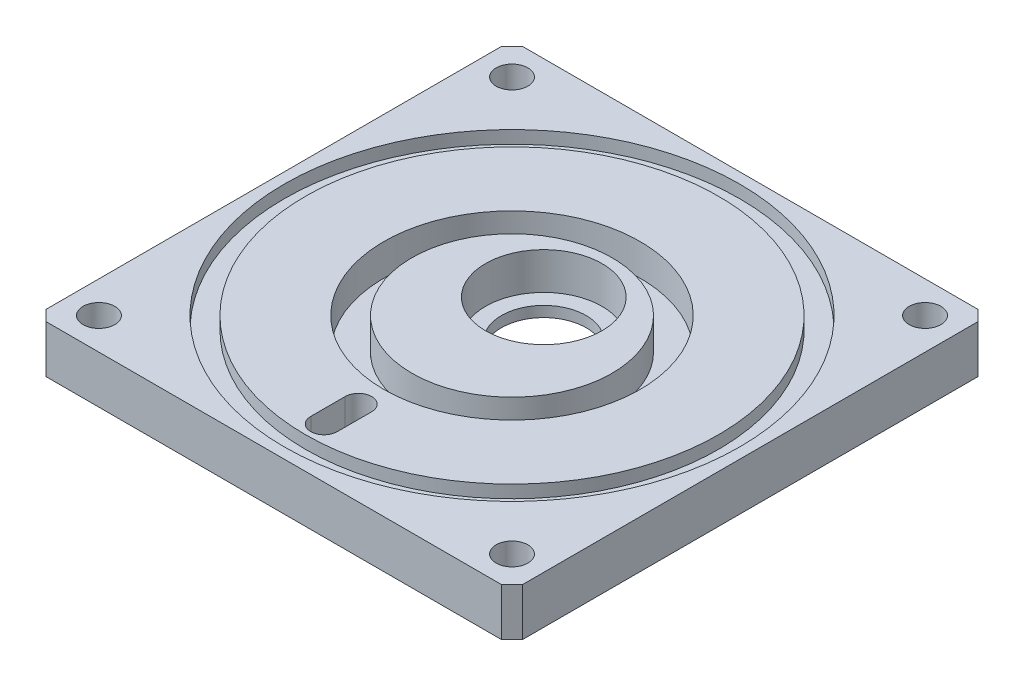
ISO-10303-21;
HEADER;
FILE_DESCRIPTION(('STEP AP214'),'2;1');
FILE_NAME('part.step','',(''),(''),'','','');
FILE_SCHEMA(('AUTOMOTIVE_DESIGN { 1 0 10303 214 1 1 1 1 }'));
ENDSEC;
DATA;
#1=APPLICATION_CONTEXT('core data for automotive mechanical design processes');
#2=APPLICATION_PROTOCOL_DEFINITION('international standard','automotive_design',2000,#1);
#3=PRODUCT_CONTEXT('',#1,'mechanical');
#4=PRODUCT('Part','Part','',(#3));
#5=PRODUCT_RELATED_PRODUCT_CATEGORY('part','',(#4));
#6=PRODUCT_DEFINITION_FORMATION('','',#4);
#7=PRODUCT_DEFINITION_CONTEXT('part definition',#1,'design');
#8=PRODUCT_DEFINITION('design','',#6,#7);
#9=PRODUCT_DEFINITION_SHAPE('','',#8);
#10=(LENGTH_UNIT() NAMED_UNIT(*) SI_UNIT(.MILLI.,.METRE.));
#11=(NAMED_UNIT(*) PLANE_ANGLE_UNIT() SI_UNIT($,.RADIAN.));
#12=(NAMED_UNIT(*) SI_UNIT($,.STERADIAN.) SOLID_ANGLE_UNIT());
#13=UNCERTAINTY_MEASURE_WITH_UNIT(LENGTH_MEASURE(1.E-05),#10,'distance_accuracy_value','');
#14=(GEOMETRIC_REPRESENTATION_CONTEXT(3) GLOBAL_UNCERTAINTY_ASSIGNED_CONTEXT((#13)) GLOBAL_UNIT_ASSIGNED_CONTEXT((#10,
#11,#12)) REPRESENTATION_CONTEXT('',''));
#15=CARTESIAN_POINT('',(0.,0.,0.));
#16=DIRECTION('',(0.,0.,1.));
#17=DIRECTION('',(1.,0.,0.));
#18=AXIS2_PLACEMENT_3D('',#15,#16,#17);
#19=CARTESIAN_POINT('',(0.,4.5,0.));
#20=DIRECTION('',(0.,-1.,0.));
#21=DIRECTION('',(0.,0.,-1.));
#22=AXIS2_PLACEMENT_3D('',#19,#20,#21);
#23=PLANE('',#22);
#24=DIRECTION('',(0.,0.,1.));
#25=VECTOR('',#24,1.);
#26=CARTESIAN_POINT('',(-1.25,4.5,14.5));
#27=LINE('',#26,#25);
#28=CARTESIAN_POINT('',(-1.25,4.5,14.5));
#29=VERTEX_POINT('',#28);
#30=CARTESIAN_POINT('',(-1.25,4.5,17.75));
#31=VERTEX_POINT('',#30);
#32=EDGE_CURVE('E174',#29,#31,#27,.T.);
#33=ORIENTED_EDGE('',*,*,#32,.F.);
#34=CARTESIAN_POINT('',(0.,4.5,14.5));
#35=DIRECTION('',(0.,1.,0.));
#36=DIRECTION('',(0.,0.,1.));
#37=AXIS2_PLACEMENT_3D('',#34,#35,#36);
#38=CIRCLE('',#37,1.25);
#39=CARTESIAN_POINT('',(1.25,4.5,14.5));
#40=VERTEX_POINT('',#39);
#41=EDGE_CURVE('E137',#40,#29,#38,.T.);
#42=ORIENTED_EDGE('',*,*,#41,.F.);
#43=DIRECTION('',(0.,0.,-1.));
#44=VECTOR('',#43,1.);
#45=CARTESIAN_POINT('',(1.25,4.5,14.5));
#46=LINE('',#45,#44);
#47=CARTESIAN_POINT('',(1.25,4.5,17.75));
#48=VERTEX_POINT('',#47);
#49=EDGE_CURVE('E158',#48,#40,#46,.T.);
#50=ORIENTED_EDGE('',*,*,#49,.F.);
#51=CARTESIAN_POINT('',(0.,4.5,17.75));
#52=DIRECTION('',(0.,1.,0.));
#53=DIRECTION('',(0.,0.,1.));
#54=AXIS2_PLACEMENT_3D('',#51,#52,#53);
#55=CIRCLE('',#54,1.25);
#56=EDGE_CURVE('E162',#31,#48,#55,.T.);
#57=ORIENTED_EDGE('',*,*,#56,.F.);
#58=EDGE_LOOP('',(#33,#42,#50,#57));
#59=FACE_BOUND('',#58,.T.);
#60=CARTESIAN_POINT('',(0.,4.5,0.));
#61=DIRECTION('',(0.,1.,0.));
#62=DIRECTION('',(0.,0.,1.));
#63=AXIS2_PLACEMENT_3D('',#60,#61,#62);
#64=CIRCLE('',#63,12.1);
#65=CARTESIAN_POINT('',(0.,4.5,12.1));
#66=VERTEX_POINT('',#65);
#67=EDGE_CURVE('E210',#66,#66,#64,.T.);
#68=ORIENTED_EDGE('',*,*,#67,.F.);
#69=EDGE_LOOP('',(#68));
#70=FACE_BOUND('',#69,.T.);
#71=CARTESIAN_POINT('',(0.,4.5,0.));
#72=DIRECTION('',(0.,1.,0.));
#73=DIRECTION('',(0.,0.,1.));
#74=AXIS2_PLACEMENT_3D('',#71,#72,#73);
#75=CIRCLE('',#74,19.5);
#76=CARTESIAN_POINT('',(0.,4.5,19.5));
#77=VERTEX_POINT('',#76);
#78=EDGE_CURVE('E184',#77,#77,#75,.T.);
#79=ORIENTED_EDGE('',*,*,#78,.T.);
#80=EDGE_LOOP('',(#79));
#81=FACE_BOUND('',#80,.T.);
#82=ADVANCED_FACE('F39',(#59,#70,#81),#23,.F.);
#83=CARTESIAN_POINT('',(0.,4.5,-3.));
#84=DIRECTION('',(0.,1.,0.));
#85=DIRECTION('',(0.,0.,1.));
#86=AXIS2_PLACEMENT_3D('',#83,#84,#85);
#87=CIRCLE('',#86,5.5);
#88=CARTESIAN_POINT('',(0.,4.5,2.5));
#89=VERTEX_POINT('',#88);
#90=EDGE_CURVE('E226',#89,#89,#87,.T.);
#91=ORIENTED_EDGE('',*,*,#90,.F.);
#92=EDGE_LOOP('',(#91));
#93=FACE_BOUND('',#92,.T.);
#94=CARTESIAN_POINT('',(0.,4.5,0.));
#95=DIRECTION('',(0.,1.,0.));
#96=DIRECTION('',(0.,0.,1.));
#97=AXIS2_PLACEMENT_3D('',#94,#95,#96);
#98=CIRCLE('',#97,9.45);
#99=CARTESIAN_POINT('',(0.,4.5,9.45));
#100=VERTEX_POINT('',#99);
#101=EDGE_CURVE('E202',#100,#100,#98,.T.);
#102=ORIENTED_EDGE('',*,*,#101,.T.);
#103=EDGE_LOOP('',(#102));
#104=FACE_BOUND('',#103,.T.);
#105=ADVANCED_FACE('F348',(#93,#104),#23,.F.);
#106=CARTESIAN_POINT('',(22.5,4.5,22.5));
#107=DIRECTION('',(-1.,0.,0.));
#108=DIRECTION('',(0.,0.,1.));
#109=AXIS2_PLACEMENT_3D('',#106,#107,#108);
#110=PLANE('',#109);
#111=DIRECTION('',(0.,0.,-1.));
#112=VECTOR('',#111,1.);
#113=CARTESIAN_POINT('',(22.5,0.,22.5));
#114=LINE('',#113,#112);
#115=CARTESIAN_POINT('',(22.5,0.,21.5));
#116=VERTEX_POINT('',#115);
#117=CARTESIAN_POINT('',(22.5,0.,-21.5));
#118=VERTEX_POINT('',#117);
#119=EDGE_CURVE('E234',#116,#118,#114,.T.);
#120=ORIENTED_EDGE('',*,*,#119,.T.);
#121=DIRECTION('',(0.,1.,0.));
#122=VECTOR('',#121,1.);
#123=CARTESIAN_POINT('',(22.5,4.5,-21.5));
#124=LINE('',#123,#122);
#125=CARTESIAN_POINT('',(22.5,4.5,-21.5));
#126=VERTEX_POINT('',#125);
#127=EDGE_CURVE('E289',#118,#126,#124,.T.);
#128=ORIENTED_EDGE('',*,*,#127,.T.);
#129=DIRECTION('',(0.,0.,-1.));
#130=VECTOR('',#129,1.);
#131=CARTESIAN_POINT('',(22.5,4.5,22.5));
#132=LINE('',#131,#130);
#133=CARTESIAN_POINT('',(22.5,4.5,21.5));
#134=VERTEX_POINT('',#133);
#135=EDGE_CURVE('E238',#134,#126,#132,.T.);
#136=ORIENTED_EDGE('',*,*,#135,.F.);
#137=DIRECTION('',(0.,-1.,0.));
#138=VECTOR('',#137,1.);
#139=CARTESIAN_POINT('',(22.5,4.5,21.5));
#140=LINE('',#139,#138);
#141=EDGE_CURVE('E285',#134,#116,#140,.T.);
#142=ORIENTED_EDGE('',*,*,#141,.T.);
#143=EDGE_LOOP('',(#120,#128,#136,#142));
#144=FACE_BOUND('',#143,.T.);
#145=ADVANCED_FACE('F333',(#144),#110,.F.);
#146=CARTESIAN_POINT('',(-22.5,4.5,-22.5));
#147=DIRECTION('',(0.,0.,1.));
#148=DIRECTION('',(1.,0.,0.));
#149=AXIS2_PLACEMENT_3D('',#146,#147,#148);
#150=PLANE('',#149);
#151=DIRECTION('',(-1.,0.,0.));
#152=VECTOR('',#151,1.);
#153=CARTESIAN_POINT('',(-22.5,4.5,-22.5));
#154=LINE('',#153,#152);
#155=CARTESIAN_POINT('',(21.5,4.5,-22.5));
#156=VERTEX_POINT('',#155);
#157=CARTESIAN_POINT('',(-21.5,4.5,-22.5));
#158=VERTEX_POINT('',#157);
#159=EDGE_CURVE('E242',#156,#158,#154,.T.);
#160=ORIENTED_EDGE('',*,*,#159,.F.);
#161=DIRECTION('',(0.,-1.,0.));
#162=VECTOR('',#161,1.);
#163=CARTESIAN_POINT('',(21.5,4.5,-22.5));
#164=LINE('',#163,#162);
#165=CARTESIAN_POINT('',(21.5,0.,-22.5));
#166=VERTEX_POINT('',#165);
#167=EDGE_CURVE('E269',#156,#166,#164,.T.);
#168=ORIENTED_EDGE('',*,*,#167,.T.);
#169=DIRECTION('',(-1.,0.,0.));
#170=VECTOR('',#169,1.);
#171=CARTESIAN_POINT('',(-22.5,0.,-22.5));
#172=LINE('',#171,#170);
#173=CARTESIAN_POINT('',(-21.5,0.,-22.5));
#174=VERTEX_POINT('',#173);
#175=EDGE_CURVE('E257',#166,#174,#172,.T.);
#176=ORIENTED_EDGE('',*,*,#175,.T.);
#177=DIRECTION('',(0.,1.,0.));
#178=VECTOR('',#177,1.);
#179=CARTESIAN_POINT('',(-21.5,4.5,-22.5));
#180=LINE('',#179,#178);
#181=EDGE_CURVE('E253',#174,#158,#180,.T.);
#182=ORIENTED_EDGE('',*,*,#181,.T.);
#183=EDGE_LOOP('',(#160,#168,#176,#182));
#184=FACE_BOUND('',#183,.T.);
#185=ADVANCED_FACE('F341',(#184),#150,.F.);
#186=CARTESIAN_POINT('',(-22.5,4.5,22.5));
#187=DIRECTION('',(1.,0.,0.));
#188=DIRECTION('',(0.,0.,-1.));
#189=AXIS2_PLACEMENT_3D('',#186,#187,#188);
#190=PLANE('',#189);
#191=DIRECTION('',(0.,0.,1.));
#192=VECTOR('',#191,1.);
#193=CARTESIAN_POINT('',(-22.5,0.,22.5));
#194=LINE('',#193,#192);
#195=CARTESIAN_POINT('',(-22.5,0.,-21.5));
#196=VERTEX_POINT('',#195);
#197=CARTESIAN_POINT('',(-22.5,0.,21.5));
#198=VERTEX_POINT('',#197);
#199=EDGE_CURVE('E261',#196,#198,#194,.T.);
#200=ORIENTED_EDGE('',*,*,#199,.T.);
#201=DIRECTION('',(0.,1.,0.));
#202=VECTOR('',#201,1.);
#203=CARTESIAN_POINT('',(-22.5,4.5,21.5));
#204=LINE('',#203,#202);
#205=CARTESIAN_POINT('',(-22.5,4.5,21.5));
#206=VERTEX_POINT('',#205);
#207=EDGE_CURVE('E11',#198,#206,#204,.T.);
#208=ORIENTED_EDGE('',*,*,#207,.T.);
#209=DIRECTION('',(0.,0.,1.));
#210=VECTOR('',#209,1.);
#211=CARTESIAN_POINT('',(-22.5,4.5,22.5));
#212=LINE('',#211,#210);
#213=CARTESIAN_POINT('',(-22.5,4.5,-21.5));
#214=VERTEX_POINT('',#213);
#215=EDGE_CURVE('E247',#214,#206,#212,.T.);
#216=ORIENTED_EDGE('',*,*,#215,.F.);
#217=DIRECTION('',(0.,-1.,0.));
#218=VECTOR('',#217,1.);
#219=CARTESIAN_POINT('',(-22.5,4.5,-21.5));
#220=LINE('',#219,#218);
#221=EDGE_CURVE('E48',#214,#196,#220,.T.);
#222=ORIENTED_EDGE('',*,*,#221,.T.);
#223=EDGE_LOOP('',(#200,#208,#216,#222));
#224=FACE_BOUND('',#223,.T.);
#225=ADVANCED_FACE('F314',(#224),#190,.F.);
#226=CARTESIAN_POINT('',(-22.5,4.5,22.5));
#227=DIRECTION('',(0.,0.,-1.));
#228=DIRECTION('',(-1.,0.,0.));
#229=AXIS2_PLACEMENT_3D('',#226,#227,#228);
#230=PLANE('',#229);
#231=DIRECTION('',(1.,0.,0.));
#232=VECTOR('',#231,1.);
#233=CARTESIAN_POINT('',(-22.5,0.,22.5));
#234=LINE('',#233,#232);
#235=CARTESIAN_POINT('',(-21.5,0.,22.5));
#236=VERTEX_POINT('',#235);
#237=CARTESIAN_POINT('',(21.5,0.,22.5));
#238=VERTEX_POINT('',#237);
#239=EDGE_CURVE('E243',#236,#238,#234,.T.);
#240=ORIENTED_EDGE('',*,*,#239,.T.);
#241=DIRECTION('',(0.,1.,0.));
#242=VECTOR('',#241,1.);
#243=CARTESIAN_POINT('',(21.5,4.5,22.5));
#244=LINE('',#243,#242);
#245=CARTESIAN_POINT('',(21.5,4.5,22.5));
#246=VERTEX_POINT('',#245);
#247=EDGE_CURVE('E55',#238,#246,#244,.T.);
#248=ORIENTED_EDGE('',*,*,#247,.T.);
#249=DIRECTION('',(1.,0.,0.));
#250=VECTOR('',#249,1.);
#251=CARTESIAN_POINT('',(-22.5,4.5,22.5));
#252=LINE('',#251,#250);
#253=CARTESIAN_POINT('',(-21.5,4.5,22.5));
#254=VERTEX_POINT('',#253);
#255=EDGE_CURVE('E250',#254,#246,#252,.T.);
#256=ORIENTED_EDGE('',*,*,#255,.F.);
#257=DIRECTION('',(0.,-1.,0.));
#258=VECTOR('',#257,1.);
#259=CARTESIAN_POINT('',(-21.5,4.5,22.5));
#260=LINE('',#259,#258);
#261=EDGE_CURVE('E303',#254,#236,#260,.T.);
#262=ORIENTED_EDGE('',*,*,#261,.T.);
#263=EDGE_LOOP('',(#240,#248,#256,#262));
#264=FACE_BOUND('',#263,.T.);
#265=ADVANCED_FACE('F324',(#264),#230,.F.);
#266=CARTESIAN_POINT('',(-19.5,4.5,-19.5));
#267=DIRECTION('',(0.,-1.,0.));
#268=DIRECTION('',(0.,0.,1.));
#269=AXIS2_PLACEMENT_3D('',#266,#267,#268);
#270=CIRCLE('',#269,1.5);
#271=CARTESIAN_POINT('',(-19.5,4.5,-18.));
#272=VERTEX_POINT('',#271);
#273=EDGE_CURVE('E370',#272,#272,#270,.T.);
#274=ORIENTED_EDGE('',*,*,#273,.T.);
#275=EDGE_LOOP('',(#274));
#276=FACE_BOUND('',#275,.T.);
#277=CARTESIAN_POINT('',(19.5,4.5,-19.5));
#278=DIRECTION('',(0.,-1.,0.));
#279=DIRECTION('',(0.,0.,-1.));
#280=AXIS2_PLACEMENT_3D('',#277,#278,#279);
#281=CIRCLE('',#280,1.5);
#282=CARTESIAN_POINT('',(19.5,4.5,-21.));
#283=VERTEX_POINT('',#282);
#284=EDGE_CURVE('E374',#283,#283,#281,.T.);
#285=ORIENTED_EDGE('',*,*,#284,.T.);
#286=EDGE_LOOP('',(#285));
#287=FACE_BOUND('',#286,.T.);
#288=CARTESIAN_POINT('',(19.5,4.5,19.5));
#289=DIRECTION('',(0.,-1.,0.));
#290=DIRECTION('',(0.,0.,1.));
#291=AXIS2_PLACEMENT_3D('',#288,#289,#290);
#292=CIRCLE('',#291,1.5);
#293=CARTESIAN_POINT('',(19.5,4.5,21.));
#294=VERTEX_POINT('',#293);
#295=EDGE_CURVE('E378',#294,#294,#292,.T.);
#296=ORIENTED_EDGE('',*,*,#295,.T.);
#297=EDGE_LOOP('',(#296));
#298=FACE_BOUND('',#297,.T.);
#299=CARTESIAN_POINT('',(-19.5,4.5,19.5));
#300=DIRECTION('',(0.,-1.,0.));
#301=DIRECTION('',(0.,0.,-1.));
#302=AXIS2_PLACEMENT_3D('',#299,#300,#301);
#303=CIRCLE('',#302,1.5);
#304=CARTESIAN_POINT('',(-19.5,4.5,18.));
#305=VERTEX_POINT('',#304);
#306=EDGE_CURVE('E175',#305,#305,#303,.T.);
#307=ORIENTED_EDGE('',*,*,#306,.T.);
#308=EDGE_LOOP('',(#307));
#309=FACE_BOUND('',#308,.T.);
#310=CARTESIAN_POINT('',(0.,4.5,0.));
#311=DIRECTION('',(0.,1.,0.));
#312=DIRECTION('',(0.,0.,1.));
#313=AXIS2_PLACEMENT_3D('',#310,#311,#312);
#314=CIRCLE('',#313,21.5);
#315=CARTESIAN_POINT('',(0.,4.5,21.5));
#316=VERTEX_POINT('',#315);
#317=EDGE_CURVE('E194',#316,#316,#314,.T.);
#318=ORIENTED_EDGE('',*,*,#317,.F.);
#319=EDGE_LOOP('',(#318));
#320=FACE_BOUND('',#319,.T.);
#321=ORIENTED_EDGE('',*,*,#135,.T.);
#322=DIRECTION('',(0.707106781186545,0.,0.70710678118655));
#323=VECTOR('',#322,1.);
#324=CARTESIAN_POINT('',(21.5,4.5,-22.5));
#325=LINE('',#324,#323);
#326=EDGE_CURVE('E300',#126,#156,#325,.F.);
#327=ORIENTED_EDGE('',*,*,#326,.T.);
#328=ORIENTED_EDGE('',*,*,#159,.T.);
#329=DIRECTION('',(0.70710678118655,0.,-0.707106781186545));
#330=VECTOR('',#329,1.);
#331=CARTESIAN_POINT('',(-22.5,4.5,-21.5));
#332=LINE('',#331,#330);
#333=EDGE_CURVE('E292',#158,#214,#332,.F.);
#334=ORIENTED_EDGE('',*,*,#333,.T.);
#335=ORIENTED_EDGE('',*,*,#215,.T.);
#336=DIRECTION('',(-0.707106781186545,0.,-0.70710678118655));
#337=VECTOR('',#336,1.);
#338=CARTESIAN_POINT('',(-21.5,4.5,22.5));
#339=LINE('',#338,#337);
#340=EDGE_CURVE('E62',#206,#254,#339,.F.);
#341=ORIENTED_EDGE('',*,*,#340,.T.);
#342=ORIENTED_EDGE('',*,*,#255,.T.);
#343=DIRECTION('',(-0.70710678118655,0.,0.707106781186545));
#344=VECTOR('',#343,1.);
#345=CARTESIAN_POINT('',(22.5,4.5,21.5));
#346=LINE('',#345,#344);
#347=EDGE_CURVE('E297',#246,#134,#346,.F.);
#348=ORIENTED_EDGE('',*,*,#347,.T.);
#349=EDGE_LOOP('',(#321,#327,#328,#334,#335,#341,#342,#348));
#350=FACE_BOUND('',#349,.T.);
#351=ADVANCED_FACE('F326',(#276,#287,#298,#309,#320,#350),#23,.F.);
#352=CARTESIAN_POINT('',(0.,0.,0.));
#353=DIRECTION('',(0.,-1.,0.));
#354=DIRECTION('',(0.,0.,-1.));
#355=AXIS2_PLACEMENT_3D('',#352,#353,#354);
#356=PLANE('',#355);
#357=CARTESIAN_POINT('',(-19.5,0.,-19.5));
#358=DIRECTION('',(0.,-1.,0.));
#359=DIRECTION('',(0.,0.,1.));
#360=AXIS2_PLACEMENT_3D('',#357,#358,#359);
#361=CIRCLE('',#360,1.5);
#362=CARTESIAN_POINT('',(-19.5,0.,-18.));
#363=VERTEX_POINT('',#362);
#364=EDGE_CURVE('E635',#363,#363,#361,.T.);
#365=ORIENTED_EDGE('',*,*,#364,.F.);
#366=EDGE_LOOP('',(#365));
#367=FACE_BOUND('',#366,.T.);
#368=CARTESIAN_POINT('',(19.5,0.,-19.5));
#369=DIRECTION('',(0.,-1.,0.));
#370=DIRECTION('',(0.,0.,-1.));
#371=AXIS2_PLACEMENT_3D('',#368,#369,#370);
#372=CIRCLE('',#371,1.5);
#373=CARTESIAN_POINT('',(19.5,0.,-21.));
#374=VERTEX_POINT('',#373);
#375=EDGE_CURVE('E639',#374,#374,#372,.T.);
#376=ORIENTED_EDGE('',*,*,#375,.F.);
#377=EDGE_LOOP('',(#376));
#378=FACE_BOUND('',#377,.T.);
#379=CARTESIAN_POINT('',(19.5,0.,19.5));
#380=DIRECTION('',(0.,-1.,0.));
#381=DIRECTION('',(0.,0.,1.));
#382=AXIS2_PLACEMENT_3D('',#379,#380,#381);
#383=CIRCLE('',#382,1.5);
#384=CARTESIAN_POINT('',(19.5,0.,21.));
#385=VERTEX_POINT('',#384);
#386=EDGE_CURVE('E648',#385,#385,#383,.T.);
#387=ORIENTED_EDGE('',*,*,#386,.F.);
#388=EDGE_LOOP('',(#387));
#389=FACE_BOUND('',#388,.T.);
#390=CARTESIAN_POINT('',(-19.5,0.,19.5));
#391=DIRECTION('',(0.,-1.,0.));
#392=DIRECTION('',(0.,0.,-1.));
#393=AXIS2_PLACEMENT_3D('',#390,#391,#392);
#394=CIRCLE('',#393,1.5);
#395=CARTESIAN_POINT('',(-19.5,0.,18.));
#396=VERTEX_POINT('',#395);
#397=EDGE_CURVE('E165',#396,#396,#394,.T.);
#398=ORIENTED_EDGE('',*,*,#397,.F.);
#399=EDGE_LOOP('',(#398));
#400=FACE_BOUND('',#399,.T.);
#401=CARTESIAN_POINT('',(0.,0.,14.5));
#402=DIRECTION('',(0.,1.,0.));
#403=DIRECTION('',(0.,0.,1.));
#404=AXIS2_PLACEMENT_3D('',#401,#402,#403);
#405=CIRCLE('',#404,1.25);
#406=CARTESIAN_POINT('',(1.25,0.,14.5));
#407=VERTEX_POINT('',#406);
#408=CARTESIAN_POINT('',(-1.25,0.,14.5));
#409=VERTEX_POINT('',#408);
#410=EDGE_CURVE('E134',#407,#409,#405,.T.);
#411=ORIENTED_EDGE('',*,*,#410,.T.);
#412=DIRECTION('',(0.,0.,1.));
#413=VECTOR('',#412,1.);
#414=CARTESIAN_POINT('',(-1.25,0.,14.5));
#415=LINE('',#414,#413);
#416=CARTESIAN_POINT('',(-1.25,0.,17.75));
#417=VERTEX_POINT('',#416);
#418=EDGE_CURVE('E147',#409,#417,#415,.T.);
#419=ORIENTED_EDGE('',*,*,#418,.T.);
#420=CARTESIAN_POINT('',(0.,0.,17.75));
#421=DIRECTION('',(0.,1.,0.));
#422=DIRECTION('',(0.,0.,1.));
#423=AXIS2_PLACEMENT_3D('',#420,#421,#422);
#424=CIRCLE('',#423,1.25);
#425=CARTESIAN_POINT('',(1.25,0.,17.75));
#426=VERTEX_POINT('',#425);
#427=EDGE_CURVE('E152',#417,#426,#424,.T.);
#428=ORIENTED_EDGE('',*,*,#427,.T.);
#429=DIRECTION('',(0.,0.,-1.));
#430=VECTOR('',#429,1.);
#431=CARTESIAN_POINT('',(1.25,0.,14.5));
#432=LINE('',#431,#430);
#433=EDGE_CURVE('E143',#426,#407,#432,.T.);
#434=ORIENTED_EDGE('',*,*,#433,.T.);
#435=EDGE_LOOP('',(#411,#419,#428,#434));
#436=FACE_BOUND('',#435,.T.);
#437=CARTESIAN_POINT('',(0.,0.,-3.));
#438=DIRECTION('',(0.,1.,0.));
#439=DIRECTION('',(0.,0.,1.));
#440=AXIS2_PLACEMENT_3D('',#437,#438,#439);
#441=CIRCLE('',#440,4.);
#442=CARTESIAN_POINT('',(0.,0.,1.));
#443=VERTEX_POINT('',#442);
#444=EDGE_CURVE('E222',#443,#443,#441,.T.);
#445=ORIENTED_EDGE('',*,*,#444,.T.);
#446=EDGE_LOOP('',(#445));
#447=FACE_BOUND('',#446,.T.);
#448=ORIENTED_EDGE('',*,*,#175,.F.);
#449=DIRECTION('',(-0.707106781186545,0.,-0.70710678118655));
#450=VECTOR('',#449,1.);
#451=CARTESIAN_POINT('',(22.0000000000001,0.,-21.9999999999999));
#452=LINE('',#451,#450);
#453=EDGE_CURVE('E282',#166,#118,#452,.F.);
#454=ORIENTED_EDGE('',*,*,#453,.T.);
#455=ORIENTED_EDGE('',*,*,#119,.F.);
#456=DIRECTION('',(0.70710678118655,0.,-0.707106781186545));
#457=VECTOR('',#456,1.);
#458=CARTESIAN_POINT('',(21.9999999999999,0.,22.0000000000001));
#459=LINE('',#458,#457);
#460=EDGE_CURVE('E279',#116,#238,#459,.F.);
#461=ORIENTED_EDGE('',*,*,#460,.T.);
#462=ORIENTED_EDGE('',*,*,#239,.F.);
#463=DIRECTION('',(0.707106781186545,0.,0.70710678118655));
#464=VECTOR('',#463,1.);
#465=CARTESIAN_POINT('',(-22.0000000000001,0.,21.9999999999999));
#466=LINE('',#465,#464);
#467=EDGE_CURVE('E276',#236,#198,#466,.F.);
#468=ORIENTED_EDGE('',*,*,#467,.T.);
#469=ORIENTED_EDGE('',*,*,#199,.F.);
#470=DIRECTION('',(-0.70710678118655,0.,0.707106781186545));
#471=VECTOR('',#470,1.);
#472=CARTESIAN_POINT('',(-21.9999999999999,0.,-22.0000000000001));
#473=LINE('',#472,#471);
#474=EDGE_CURVE('E273',#196,#174,#473,.F.);
#475=ORIENTED_EDGE('',*,*,#474,.T.);
#476=EDGE_LOOP('',(#448,#454,#455,#461,#462,#468,#469,#475));
#477=FACE_BOUND('',#476,.T.);
#478=ADVANCED_FACE('F154',(#367,#378,#389,#400,#436,#447,#477),#356,.T.);
#479=CARTESIAN_POINT('',(0.,1.,-3.));
#480=DIRECTION('',(0.,1.,0.));
#481=DIRECTION('',(0.,0.,1.));
#482=AXIS2_PLACEMENT_3D('',#479,#480,#481);
#483=CYLINDRICAL_SURFACE('',#482,5.5);
#484=CARTESIAN_POINT('',(0.,1.,-3.));
#485=DIRECTION('',(0.,1.,0.));
#486=DIRECTION('',(0.,0.,1.));
#487=AXIS2_PLACEMENT_3D('',#484,#485,#486);
#488=CIRCLE('',#487,5.5);
#489=CARTESIAN_POINT('',(0.,1.,2.5));
#490=VERTEX_POINT('',#489);
#491=EDGE_CURVE('E230',#490,#490,#488,.T.);
#492=ORIENTED_EDGE('',*,*,#491,.F.);
#493=EDGE_LOOP('',(#492));
#494=FACE_BOUND('',#493,.T.);
#495=ORIENTED_EDGE('',*,*,#90,.T.);
#496=EDGE_LOOP('',(#495));
#497=FACE_BOUND('',#496,.T.);
#498=ADVANCED_FACE('F364',(#494,#497),#483,.F.);
#499=CARTESIAN_POINT('',(0.,1.,-3.));
#500=DIRECTION('',(0.,1.,0.));
#501=DIRECTION('',(0.,0.,1.));
#502=AXIS2_PLACEMENT_3D('',#499,#500,#501);
#503=PLANE('',#502);
#504=CARTESIAN_POINT('',(0.,1.,-3.));
#505=DIRECTION('',(0.,1.,0.));
#506=DIRECTION('',(0.,0.,1.));
#507=AXIS2_PLACEMENT_3D('',#504,#505,#506);
#508=CIRCLE('',#507,4.);
#509=CARTESIAN_POINT('',(0.,1.,1.));
#510=VERTEX_POINT('',#509);
#511=EDGE_CURVE('E218',#510,#510,#508,.T.);
#512=ORIENTED_EDGE('',*,*,#511,.F.);
#513=EDGE_LOOP('',(#512));
#514=FACE_BOUND('',#513,.T.);
#515=ORIENTED_EDGE('',*,*,#491,.T.);
#516=EDGE_LOOP('',(#515));
#517=FACE_BOUND('',#516,.T.);
#518=ADVANCED_FACE('F413',(#514,#517),#503,.T.);
#519=CARTESIAN_POINT('',(0.,0.,-3.));
#520=DIRECTION('',(0.,1.,0.));
#521=DIRECTION('',(0.,0.,1.));
#522=AXIS2_PLACEMENT_3D('',#519,#520,#521);
#523=CYLINDRICAL_SURFACE('',#522,4.);
#524=ORIENTED_EDGE('',*,*,#444,.F.);
#525=EDGE_LOOP('',(#524));
#526=FACE_BOUND('',#525,.T.);
#527=ORIENTED_EDGE('',*,*,#511,.T.);
#528=EDGE_LOOP('',(#527));
#529=FACE_BOUND('',#528,.T.);
#530=ADVANCED_FACE('F409',(#526,#529),#523,.F.);
#531=CARTESIAN_POINT('',(0.,1.5,0.));
#532=DIRECTION('',(0.,1.,0.));
#533=DIRECTION('',(0.,0.,1.));
#534=AXIS2_PLACEMENT_3D('',#531,#532,#533);
#535=CYLINDRICAL_SURFACE('',#534,12.1);
#536=CARTESIAN_POINT('',(0.,1.5,0.));
#537=DIRECTION('',(0.,1.,0.));
#538=DIRECTION('',(0.,0.,1.));
#539=AXIS2_PLACEMENT_3D('',#536,#537,#538);
#540=CIRCLE('',#539,12.1);
#541=CARTESIAN_POINT('',(0.,1.5,12.1));
#542=VERTEX_POINT('',#541);
#543=EDGE_CURVE('E214',#542,#542,#540,.T.);
#544=ORIENTED_EDGE('',*,*,#543,.F.);
#545=EDGE_LOOP('',(#544));
#546=FACE_BOUND('',#545,.T.);
#547=ORIENTED_EDGE('',*,*,#67,.T.);
#548=EDGE_LOOP('',(#547));
#549=FACE_BOUND('',#548,.T.);
#550=ADVANCED_FACE('F405',(#546,#549),#535,.F.);
#551=CARTESIAN_POINT('',(0.,1.5,0.));
#552=DIRECTION('',(0.,1.,0.));
#553=DIRECTION('',(0.,0.,1.));
#554=AXIS2_PLACEMENT_3D('',#551,#552,#553);
#555=PLANE('',#554);
#556=CARTESIAN_POINT('',(0.,1.5,0.));
#557=DIRECTION('',(0.,1.,0.));
#558=DIRECTION('',(0.,0.,1.));
#559=AXIS2_PLACEMENT_3D('',#556,#557,#558);
#560=CIRCLE('',#559,9.45);
#561=CARTESIAN_POINT('',(0.,1.5,9.45));
#562=VERTEX_POINT('',#561);
#563=EDGE_CURVE('E206',#562,#562,#560,.T.);
#564=ORIENTED_EDGE('',*,*,#563,.F.);
#565=EDGE_LOOP('',(#564));
#566=FACE_BOUND('',#565,.T.);
#567=ORIENTED_EDGE('',*,*,#543,.T.);
#568=EDGE_LOOP('',(#567));
#569=FACE_BOUND('',#568,.T.);
#570=ADVANCED_FACE('F397',(#566,#569),#555,.T.);
#571=CARTESIAN_POINT('',(0.,1.5,0.));
#572=DIRECTION('',(0.,1.,0.));
#573=DIRECTION('',(0.,0.,1.));
#574=AXIS2_PLACEMENT_3D('',#571,#572,#573);
#575=CYLINDRICAL_SURFACE('',#574,9.45);
#576=ORIENTED_EDGE('',*,*,#563,.T.);
#577=EDGE_LOOP('',(#576));
#578=FACE_BOUND('',#577,.T.);
#579=ORIENTED_EDGE('',*,*,#101,.F.);
#580=EDGE_LOOP('',(#579));
#581=FACE_BOUND('',#580,.T.);
#582=ADVANCED_FACE('F387',(#578,#581),#575,.T.);
#583=CARTESIAN_POINT('',(0.,3.3,0.));
#584=DIRECTION('',(0.,1.,0.));
#585=DIRECTION('',(0.,0.,1.));
#586=AXIS2_PLACEMENT_3D('',#583,#584,#585);
#587=CYLINDRICAL_SURFACE('',#586,21.5);
#588=CARTESIAN_POINT('',(0.,3.3,0.));
#589=DIRECTION('',(0.,1.,0.));
#590=DIRECTION('',(0.,0.,1.));
#591=AXIS2_PLACEMENT_3D('',#588,#589,#590);
#592=CIRCLE('',#591,21.5);
#593=CARTESIAN_POINT('',(0.,3.3,21.5));
#594=VERTEX_POINT('',#593);
#595=EDGE_CURVE('E198',#594,#594,#592,.T.);
#596=ORIENTED_EDGE('',*,*,#595,.F.);
#597=EDGE_LOOP('',(#596));
#598=FACE_BOUND('',#597,.T.);
#599=ORIENTED_EDGE('',*,*,#317,.T.);
#600=EDGE_LOOP('',(#599));
#601=FACE_BOUND('',#600,.T.);
#602=ADVANCED_FACE('F384',(#598,#601),#587,.F.);
#603=CARTESIAN_POINT('',(0.,3.3,0.));
#604=DIRECTION('',(0.,1.,0.));
#605=DIRECTION('',(0.,0.,1.));
#606=AXIS2_PLACEMENT_3D('',#603,#604,#605);
#607=PLANE('',#606);
#608=CARTESIAN_POINT('',(0.,3.3,0.));
#609=DIRECTION('',(0.,1.,0.));
#610=DIRECTION('',(0.,0.,1.));
#611=AXIS2_PLACEMENT_3D('',#608,#609,#610);
#612=CIRCLE('',#611,19.5);
#613=CARTESIAN_POINT('',(0.,3.3,19.5));
#614=VERTEX_POINT('',#613);
#615=EDGE_CURVE('E190',#614,#614,#612,.T.);
#616=ORIENTED_EDGE('',*,*,#615,.F.);
#617=EDGE_LOOP('',(#616));
#618=FACE_BOUND('',#617,.T.);
#619=ORIENTED_EDGE('',*,*,#595,.T.);
#620=EDGE_LOOP('',(#619));
#621=FACE_BOUND('',#620,.T.);
#622=ADVANCED_FACE('F386',(#618,#621),#607,.T.);
#623=CARTESIAN_POINT('',(0.,3.3,0.));
#624=DIRECTION('',(0.,1.,0.));
#625=DIRECTION('',(0.,0.,1.));
#626=AXIS2_PLACEMENT_3D('',#623,#624,#625);
#627=CYLINDRICAL_SURFACE('',#626,19.5);
#628=ORIENTED_EDGE('',*,*,#615,.T.);
#629=EDGE_LOOP('',(#628));
#630=FACE_BOUND('',#629,.T.);
#631=ORIENTED_EDGE('',*,*,#78,.F.);
#632=EDGE_LOOP('',(#631));
#633=FACE_BOUND('',#632,.T.);
#634=ADVANCED_FACE('F394',(#630,#633),#627,.T.);
#635=CARTESIAN_POINT('',(0.,0.,14.5));
#636=DIRECTION('',(0.,1.,0.));
#637=DIRECTION('',(0.,0.,1.));
#638=AXIS2_PLACEMENT_3D('',#635,#636,#637);
#639=CYLINDRICAL_SURFACE('',#638,1.25);
#640=ORIENTED_EDGE('',*,*,#41,.T.);
#641=DIRECTION('',(0.,1.,0.));
#642=VECTOR('',#641,1.);
#643=CARTESIAN_POINT('',(-1.25,0.,14.5));
#644=LINE('',#643,#642);
#645=EDGE_CURVE('E130',#409,#29,#644,.T.);
#646=ORIENTED_EDGE('',*,*,#645,.F.);
#647=ORIENTED_EDGE('',*,*,#410,.F.);
#648=DIRECTION('',(0.,1.,0.));
#649=VECTOR('',#648,1.);
#650=CARTESIAN_POINT('',(1.25,0.,14.5));
#651=LINE('',#650,#649);
#652=EDGE_CURVE('E181',#407,#40,#651,.T.);
#653=ORIENTED_EDGE('',*,*,#652,.T.);
#654=EDGE_LOOP('',(#640,#646,#647,#653));
#655=FACE_BOUND('',#654,.T.);
#656=ADVANCED_FACE('F132',(#655),#639,.F.);
#657=CARTESIAN_POINT('',(1.25,0.,14.5));
#658=DIRECTION('',(1.,0.,0.));
#659=DIRECTION('',(0.,0.,-1.));
#660=AXIS2_PLACEMENT_3D('',#657,#658,#659);
#661=PLANE('',#660);
#662=ORIENTED_EDGE('',*,*,#49,.T.);
#663=ORIENTED_EDGE('',*,*,#652,.F.);
#664=ORIENTED_EDGE('',*,*,#433,.F.);
#665=DIRECTION('',(0.,1.,0.));
#666=VECTOR('',#665,1.);
#667=CARTESIAN_POINT('',(1.25,0.,17.75));
#668=LINE('',#667,#666);
#669=EDGE_CURVE('E185',#426,#48,#668,.T.);
#670=ORIENTED_EDGE('',*,*,#669,.T.);
#671=EDGE_LOOP('',(#662,#663,#664,#670));
#672=FACE_BOUND('',#671,.T.);
#673=ADVANCED_FACE('F482',(#672),#661,.F.);
#674=CARTESIAN_POINT('',(0.,0.,17.75));
#675=DIRECTION('',(0.,1.,0.));
#676=DIRECTION('',(0.,0.,1.));
#677=AXIS2_PLACEMENT_3D('',#674,#675,#676);
#678=CYLINDRICAL_SURFACE('',#677,1.25);
#679=ORIENTED_EDGE('',*,*,#56,.T.);
#680=ORIENTED_EDGE('',*,*,#669,.F.);
#681=ORIENTED_EDGE('',*,*,#427,.F.);
#682=DIRECTION('',(0.,1.,0.));
#683=VECTOR('',#682,1.);
#684=CARTESIAN_POINT('',(-1.25,0.,17.75));
#685=LINE('',#684,#683);
#686=EDGE_CURVE('E142',#417,#31,#685,.T.);
#687=ORIENTED_EDGE('',*,*,#686,.T.);
#688=EDGE_LOOP('',(#679,#680,#681,#687));
#689=FACE_BOUND('',#688,.T.);
#690=ADVANCED_FACE('F491',(#689),#678,.F.);
#691=CARTESIAN_POINT('',(-1.25,0.,14.5));
#692=DIRECTION('',(-1.,0.,0.));
#693=DIRECTION('',(0.,0.,1.));
#694=AXIS2_PLACEMENT_3D('',#691,#692,#693);
#695=PLANE('',#694);
#696=ORIENTED_EDGE('',*,*,#32,.T.);
#697=ORIENTED_EDGE('',*,*,#686,.F.);
#698=ORIENTED_EDGE('',*,*,#418,.F.);
#699=ORIENTED_EDGE('',*,*,#645,.T.);
#700=EDGE_LOOP('',(#696,#697,#698,#699));
#701=FACE_BOUND('',#700,.T.);
#702=ADVANCED_FACE('F148',(#701),#695,.F.);
#703=CARTESIAN_POINT('',(-19.5,4.5,19.5));
#704=DIRECTION('',(0.,-1.,0.));
#705=DIRECTION('',(0.,0.,-1.));
#706=AXIS2_PLACEMENT_3D('',#703,#704,#705);
#707=CYLINDRICAL_SURFACE('',#706,1.5);
#708=ORIENTED_EDGE('',*,*,#306,.F.);
#709=EDGE_LOOP('',(#708));
#710=FACE_BOUND('',#709,.T.);
#711=ORIENTED_EDGE('',*,*,#397,.T.);
#712=EDGE_LOOP('',(#711));
#713=FACE_BOUND('',#712,.T.);
#714=ADVANCED_FACE('F510',(#710,#713),#707,.F.);
#715=CARTESIAN_POINT('',(19.5,4.5,19.5));
#716=DIRECTION('',(0.,-1.,0.));
#717=DIRECTION('',(0.,0.,-1.));
#718=AXIS2_PLACEMENT_3D('',#715,#716,#717);
#719=CYLINDRICAL_SURFACE('',#718,1.5);
#720=ORIENTED_EDGE('',*,*,#295,.F.);
#721=EDGE_LOOP('',(#720));
#722=FACE_BOUND('',#721,.T.);
#723=ORIENTED_EDGE('',*,*,#386,.T.);
#724=EDGE_LOOP('',(#723));
#725=FACE_BOUND('',#724,.T.);
#726=ADVANCED_FACE('F519',(#722,#725),#719,.F.);
#727=CARTESIAN_POINT('',(19.5,4.5,-19.5));
#728=DIRECTION('',(0.,-1.,0.));
#729=DIRECTION('',(0.,0.,-1.));
#730=AXIS2_PLACEMENT_3D('',#727,#728,#729);
#731=CYLINDRICAL_SURFACE('',#730,1.5);
#732=ORIENTED_EDGE('',*,*,#284,.F.);
#733=EDGE_LOOP('',(#732));
#734=FACE_BOUND('',#733,.T.);
#735=ORIENTED_EDGE('',*,*,#375,.T.);
#736=EDGE_LOOP('',(#735));
#737=FACE_BOUND('',#736,.T.);
#738=ADVANCED_FACE('F529',(#734,#737),#731,.F.);
#739=CARTESIAN_POINT('',(-19.5,4.5,-19.5));
#740=DIRECTION('',(0.,-1.,0.));
#741=DIRECTION('',(0.,0.,-1.));
#742=AXIS2_PLACEMENT_3D('',#739,#740,#741);
#743=CYLINDRICAL_SURFACE('',#742,1.5);
#744=ORIENTED_EDGE('',*,*,#273,.F.);
#745=EDGE_LOOP('',(#744));
#746=FACE_BOUND('',#745,.T.);
#747=ORIENTED_EDGE('',*,*,#364,.T.);
#748=EDGE_LOOP('',(#747));
#749=FACE_BOUND('',#748,.T.);
#750=ADVANCED_FACE('F539',(#746,#749),#743,.F.);
#751=CARTESIAN_POINT('',(21.5,4.5,-22.5));
#752=DIRECTION('',(-0.70710678118655,0.,0.707106781186545));
#753=DIRECTION('',(0.,-1.,0.));
#754=AXIS2_PLACEMENT_3D('',#751,#752,#753);
#755=PLANE('',#754);
#756=ORIENTED_EDGE('',*,*,#326,.F.);
#757=ORIENTED_EDGE('',*,*,#127,.F.);
#758=ORIENTED_EDGE('',*,*,#453,.F.);
#759=ORIENTED_EDGE('',*,*,#167,.F.);
#760=EDGE_LOOP('',(#756,#757,#758,#759));
#761=FACE_BOUND('',#760,.T.);
#762=ADVANCED_FACE('F338',(#761),#755,.F.);
#763=CARTESIAN_POINT('',(22.5,4.5,21.5));
#764=DIRECTION('',(-0.707106781186545,0.,-0.70710678118655));
#765=DIRECTION('',(0.,-1.,0.));
#766=AXIS2_PLACEMENT_3D('',#763,#764,#765);
#767=PLANE('',#766);
#768=ORIENTED_EDGE('',*,*,#347,.F.);
#769=ORIENTED_EDGE('',*,*,#247,.F.);
#770=ORIENTED_EDGE('',*,*,#460,.F.);
#771=ORIENTED_EDGE('',*,*,#141,.F.);
#772=EDGE_LOOP('',(#768,#769,#770,#771));
#773=FACE_BOUND('',#772,.T.);
#774=ADVANCED_FACE('F330',(#773),#767,.F.);
#775=CARTESIAN_POINT('',(-21.5,4.5,22.5));
#776=DIRECTION('',(0.70710678118655,0.,-0.707106781186545));
#777=DIRECTION('',(0.,-1.,0.));
#778=AXIS2_PLACEMENT_3D('',#775,#776,#777);
#779=PLANE('',#778);
#780=ORIENTED_EDGE('',*,*,#340,.F.);
#781=ORIENTED_EDGE('',*,*,#207,.F.);
#782=ORIENTED_EDGE('',*,*,#467,.F.);
#783=ORIENTED_EDGE('',*,*,#261,.F.);
#784=EDGE_LOOP('',(#780,#781,#782,#783));
#785=FACE_BOUND('',#784,.T.);
#786=ADVANCED_FACE('F323',(#785),#779,.F.);
#787=CARTESIAN_POINT('',(-22.5,4.5,-21.5));
#788=DIRECTION('',(0.707106781186545,0.,0.70710678118655));
#789=DIRECTION('',(0.,-1.,0.));
#790=AXIS2_PLACEMENT_3D('',#787,#788,#789);
#791=PLANE('',#790);
#792=ORIENTED_EDGE('',*,*,#333,.F.);
#793=ORIENTED_EDGE('',*,*,#181,.F.);
#794=ORIENTED_EDGE('',*,*,#474,.F.);
#795=ORIENTED_EDGE('',*,*,#221,.F.);
#796=EDGE_LOOP('',(#792,#793,#794,#795));
#797=FACE_BOUND('',#796,.T.);
#798=ADVANCED_FACE('F41',(#797),#791,.F.);
#799=CLOSED_SHELL('',(#82,#105,#145,#185,#225,#265,#351,#478,#498,#518,#530,#550,#570,#582,#602,
#622,#634,#656,#673,#690,#702,#714,#726,#738,#750,#762,#774,#786,#798));
#800=MANIFOLD_SOLID_BREP('B2',#799);
#801=ADVANCED_BREP_SHAPE_REPRESENTATION('',(#18,#800),#14);
#802=SHAPE_DEFINITION_REPRESENTATION(#9,#801);
ENDSEC;
END-ISO-10303-21;
